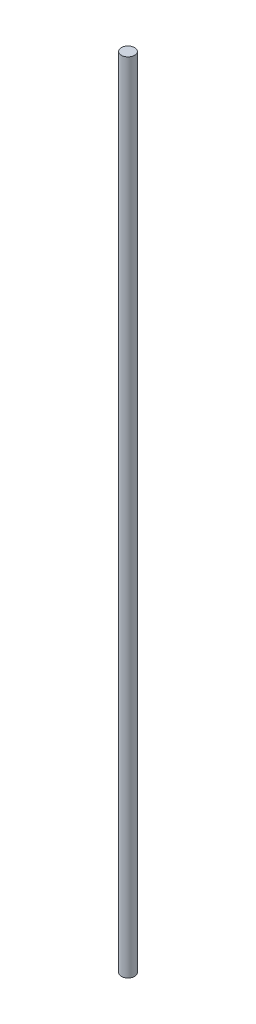
ISO-10303-21;
HEADER;
FILE_DESCRIPTION(('STEP AP214'),'2;1');
FILE_NAME('part.step','',(''),(''),'','','');
FILE_SCHEMA(('AUTOMOTIVE_DESIGN { 1 0 10303 214 1 1 1 1 }'));
ENDSEC;
DATA;
#1=APPLICATION_CONTEXT('core data for automotive mechanical design processes');
#2=APPLICATION_PROTOCOL_DEFINITION('international standard','automotive_design',2000,#1);
#3=PRODUCT_CONTEXT('',#1,'mechanical');
#4=PRODUCT('Part','Part','',(#3));
#5=PRODUCT_RELATED_PRODUCT_CATEGORY('part','',(#4));
#6=PRODUCT_DEFINITION_FORMATION('','',#4);
#7=PRODUCT_DEFINITION_CONTEXT('part definition',#1,'design');
#8=PRODUCT_DEFINITION('design','',#6,#7);
#9=PRODUCT_DEFINITION_SHAPE('','',#8);
#10=(LENGTH_UNIT() NAMED_UNIT(*) SI_UNIT(.MILLI.,.METRE.));
#11=(NAMED_UNIT(*) PLANE_ANGLE_UNIT() SI_UNIT($,.RADIAN.));
#12=(NAMED_UNIT(*) SI_UNIT($,.STERADIAN.) SOLID_ANGLE_UNIT());
#13=UNCERTAINTY_MEASURE_WITH_UNIT(LENGTH_MEASURE(1.E-05),#10,'distance_accuracy_value','');
#14=(GEOMETRIC_REPRESENTATION_CONTEXT(3) GLOBAL_UNCERTAINTY_ASSIGNED_CONTEXT((#13)) GLOBAL_UNIT_ASSIGNED_CONTEXT((#10,
#11,#12)) REPRESENTATION_CONTEXT('',''));
#15=CARTESIAN_POINT('',(0.,0.,0.));
#16=DIRECTION('',(0.,0.,1.));
#17=DIRECTION('',(1.,0.,0.));
#18=AXIS2_PLACEMENT_3D('',#15,#16,#17);
#19=CARTESIAN_POINT('',(0.,299.,0.));
#20=DIRECTION('',(0.,-1.,0.));
#21=DIRECTION('',(0.,0.,-1.));
#22=AXIS2_PLACEMENT_3D('',#19,#20,#21);
#23=CYLINDRICAL_SURFACE('',#22,2.5);
#24=CARTESIAN_POINT('',(0.,299.,0.));
#25=DIRECTION('',(0.,1.,0.));
#26=DIRECTION('',(0.,0.,1.));
#27=AXIS2_PLACEMENT_3D('',#24,#25,#26);
#28=CIRCLE('',#27,2.5);
#29=CARTESIAN_POINT('',(0.,299.,2.5));
#30=VERTEX_POINT('',#29);
#31=EDGE_CURVE('E10',#30,#30,#28,.T.);
#32=ORIENTED_EDGE('',*,*,#31,.F.);
#33=EDGE_LOOP('',(#32));
#34=FACE_BOUND('',#33,.T.);
#35=CARTESIAN_POINT('',(0.,0.,0.));
#36=DIRECTION('',(0.,1.,0.));
#37=DIRECTION('',(0.,0.,1.));
#38=AXIS2_PLACEMENT_3D('',#35,#36,#37);
#39=CIRCLE('',#38,2.5);
#40=CARTESIAN_POINT('',(0.,0.,2.5));
#41=VERTEX_POINT('',#40);
#42=EDGE_CURVE('E34',#41,#41,#39,.T.);
#43=ORIENTED_EDGE('',*,*,#42,.T.);
#44=EDGE_LOOP('',(#43));
#45=FACE_BOUND('',#44,.T.);
#46=ADVANCED_FACE('F31',(#34,#45),#23,.T.);
#47=CARTESIAN_POINT('',(0.,299.,0.));
#48=DIRECTION('',(0.,1.,0.));
#49=DIRECTION('',(0.,0.,1.));
#50=AXIS2_PLACEMENT_3D('',#47,#48,#49);
#51=PLANE('',#50);
#52=ORIENTED_EDGE('',*,*,#31,.T.);
#53=EDGE_LOOP('',(#52));
#54=FACE_BOUND('',#53,.T.);
#55=ADVANCED_FACE('F46',(#54),#51,.T.);
#56=CARTESIAN_POINT('',(0.,0.,0.));
#57=DIRECTION('',(0.,1.,0.));
#58=DIRECTION('',(0.,0.,1.));
#59=AXIS2_PLACEMENT_3D('',#56,#57,#58);
#60=PLANE('',#59);
#61=ORIENTED_EDGE('',*,*,#42,.F.);
#62=EDGE_LOOP('',(#61));
#63=FACE_BOUND('',#62,.T.);
#64=ADVANCED_FACE('F44',(#63),#60,.F.);
#65=CLOSED_SHELL('',(#46,#55,#64));
#66=MANIFOLD_SOLID_BREP('B2',#65);
#67=ADVANCED_BREP_SHAPE_REPRESENTATION('',(#18,#66),#14);
#68=SHAPE_DEFINITION_REPRESENTATION(#9,#67);
ENDSEC;
END-ISO-10303-21;
